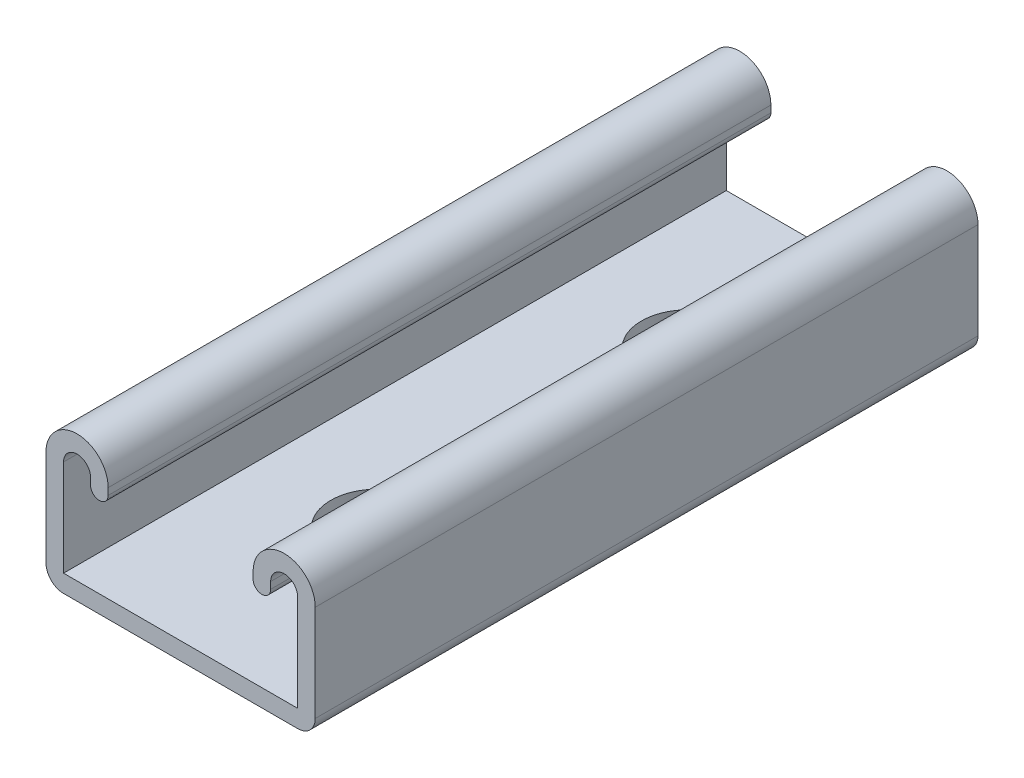
ISO-10303-21;
HEADER;
FILE_DESCRIPTION(('STEP AP214'),'2;1');
FILE_NAME('part.step','',(''),(''),'','','');
FILE_SCHEMA(('AUTOMOTIVE_DESIGN { 1 0 10303 214 1 1 1 1 }'));
ENDSEC;
DATA;
#1=APPLICATION_CONTEXT('core data for automotive mechanical design processes');
#2=APPLICATION_PROTOCOL_DEFINITION('international standard','automotive_design',2000,#1);
#3=PRODUCT_CONTEXT('',#1,'mechanical');
#4=PRODUCT('Part','Part','',(#3));
#5=PRODUCT_RELATED_PRODUCT_CATEGORY('part','',(#4));
#6=PRODUCT_DEFINITION_FORMATION('','',#4);
#7=PRODUCT_DEFINITION_CONTEXT('part definition',#1,'design');
#8=PRODUCT_DEFINITION('design','',#6,#7);
#9=PRODUCT_DEFINITION_SHAPE('','',#8);
#10=(LENGTH_UNIT() NAMED_UNIT(*) SI_UNIT(.MILLI.,.METRE.));
#11=(NAMED_UNIT(*) PLANE_ANGLE_UNIT() SI_UNIT($,.RADIAN.));
#12=(NAMED_UNIT(*) SI_UNIT($,.STERADIAN.) SOLID_ANGLE_UNIT());
#13=UNCERTAINTY_MEASURE_WITH_UNIT(LENGTH_MEASURE(1.E-05),#10,'distance_accuracy_value','');
#14=(GEOMETRIC_REPRESENTATION_CONTEXT(3) GLOBAL_UNCERTAINTY_ASSIGNED_CONTEXT((#13)) GLOBAL_UNIT_ASSIGNED_CONTEXT((#10,
#11,#12)) REPRESENTATION_CONTEXT('',''));
#15=CARTESIAN_POINT('',(0.,0.,0.));
#16=DIRECTION('',(0.,0.,1.));
#17=DIRECTION('',(1.,0.,0.));
#18=AXIS2_PLACEMENT_3D('',#15,#16,#17);
#19=CARTESIAN_POINT('',(-15.875,8.3693,101.6));
#20=DIRECTION('',(0.,0.,-1.));
#21=DIRECTION('',(-1.,0.,0.));
#22=AXIS2_PLACEMENT_3D('',#19,#20,#21);
#23=CYLINDRICAL_SURFACE('',#22,4.7625);
#24=CARTESIAN_POINT('',(-15.875,8.3693,0.));
#25=DIRECTION('',(0.,0.,1.));
#26=DIRECTION('',(-1.,0.,0.));
#27=AXIS2_PLACEMENT_3D('',#24,#25,#26);
#28=CIRCLE('',#27,4.7625);
#29=CARTESIAN_POINT('',(-11.1125,8.3693,0.));
#30=VERTEX_POINT('',#29);
#31=CARTESIAN_POINT('',(-20.6375,8.3693,0.));
#32=VERTEX_POINT('',#31);
#33=EDGE_CURVE('E189',#30,#32,#28,.T.);
#34=ORIENTED_EDGE('',*,*,#33,.T.);
#35=DIRECTION('',(0.,0.,-1.));
#36=VECTOR('',#35,1.);
#37=CARTESIAN_POINT('',(-20.6375,8.3693,101.6));
#38=LINE('',#37,#36);
#39=CARTESIAN_POINT('',(-20.6375,8.3693,101.6));
#40=VERTEX_POINT('',#39);
#41=EDGE_CURVE('E11',#40,#32,#38,.T.);
#42=ORIENTED_EDGE('',*,*,#41,.F.);
#43=CARTESIAN_POINT('',(-15.875,8.3693,101.6));
#44=DIRECTION('',(0.,0.,1.));
#45=DIRECTION('',(-1.,0.,0.));
#46=AXIS2_PLACEMENT_3D('',#43,#44,#45);
#47=CIRCLE('',#46,4.7625);
#48=CARTESIAN_POINT('',(-11.1125,8.3693,101.6));
#49=VERTEX_POINT('',#48);
#50=EDGE_CURVE('E223',#49,#40,#47,.T.);
#51=ORIENTED_EDGE('',*,*,#50,.F.);
#52=DIRECTION('',(0.,0.,-1.));
#53=VECTOR('',#52,1.);
#54=CARTESIAN_POINT('',(-11.1125,8.3693,101.6));
#55=LINE('',#54,#53);
#56=EDGE_CURVE('E185',#49,#30,#55,.T.);
#57=ORIENTED_EDGE('',*,*,#56,.T.);
#58=EDGE_LOOP('',(#34,#42,#51,#57));
#59=FACE_BOUND('',#58,.T.);
#60=ADVANCED_FACE('F32',(#59),#23,.T.);
#61=CARTESIAN_POINT('',(-20.6375,8.3693,101.6));
#62=DIRECTION('',(1.,0.,0.));
#63=DIRECTION('',(0.,1.,0.));
#64=AXIS2_PLACEMENT_3D('',#61,#62,#63);
#65=PLANE('',#64);
#66=DIRECTION('',(0.,-1.,0.));
#67=VECTOR('',#66,1.);
#68=CARTESIAN_POINT('',(-20.6375,8.3693,0.));
#69=LINE('',#68,#67);
#70=CARTESIAN_POINT('',(-20.6375,-6.4008,0.));
#71=VERTEX_POINT('',#70);
#72=EDGE_CURVE('E192',#32,#71,#69,.T.);
#73=ORIENTED_EDGE('',*,*,#72,.T.);
#74=DIRECTION('',(0.,0.,-1.));
#75=VECTOR('',#74,1.);
#76=CARTESIAN_POINT('',(-20.6375,-6.4008,101.6));
#77=LINE('',#76,#75);
#78=CARTESIAN_POINT('',(-20.6375,-6.4008,101.6));
#79=VERTEX_POINT('',#78);
#80=EDGE_CURVE('E41',#79,#71,#77,.T.);
#81=ORIENTED_EDGE('',*,*,#80,.F.);
#82=DIRECTION('',(0.,-1.,0.));
#83=VECTOR('',#82,1.);
#84=CARTESIAN_POINT('',(-20.6375,8.3693,101.6));
#85=LINE('',#84,#83);
#86=EDGE_CURVE('E122',#40,#79,#85,.T.);
#87=ORIENTED_EDGE('',*,*,#86,.F.);
#88=ORIENTED_EDGE('',*,*,#41,.T.);
#89=EDGE_LOOP('',(#73,#81,#87,#88));
#90=FACE_BOUND('',#89,.T.);
#91=ADVANCED_FACE('F332',(#90),#65,.F.);
#92=CARTESIAN_POINT('',(-17.9451,-6.4008,101.6));
#93=DIRECTION('',(0.,0.,-1.));
#94=DIRECTION('',(-1.,0.,0.));
#95=AXIS2_PLACEMENT_3D('',#92,#93,#94);
#96=CYLINDRICAL_SURFACE('',#95,2.6924);
#97=CARTESIAN_POINT('',(-17.9451,-6.4008,0.));
#98=DIRECTION('',(0.,0.,1.));
#99=DIRECTION('',(-1.,0.,0.));
#100=AXIS2_PLACEMENT_3D('',#97,#98,#99);
#101=CIRCLE('',#100,2.6924);
#102=CARTESIAN_POINT('',(-17.9451,-9.0932,0.));
#103=VERTEX_POINT('',#102);
#104=EDGE_CURVE('E194',#71,#103,#101,.T.);
#105=ORIENTED_EDGE('',*,*,#104,.T.);
#106=DIRECTION('',(0.,0.,-1.));
#107=VECTOR('',#106,1.);
#108=CARTESIAN_POINT('',(-17.9451,-9.0932,101.6));
#109=LINE('',#108,#107);
#110=CARTESIAN_POINT('',(-17.9451,-9.0932,101.6));
#111=VERTEX_POINT('',#110);
#112=EDGE_CURVE('E260',#111,#103,#109,.T.);
#113=ORIENTED_EDGE('',*,*,#112,.F.);
#114=CARTESIAN_POINT('',(-17.9451,-6.4008,101.6));
#115=DIRECTION('',(0.,0.,1.));
#116=DIRECTION('',(-1.,0.,0.));
#117=AXIS2_PLACEMENT_3D('',#114,#115,#116);
#118=CIRCLE('',#117,2.6924);
#119=EDGE_CURVE('E269',#79,#111,#118,.T.);
#120=ORIENTED_EDGE('',*,*,#119,.F.);
#121=ORIENTED_EDGE('',*,*,#80,.T.);
#122=EDGE_LOOP('',(#105,#113,#120,#121));
#123=FACE_BOUND('',#122,.T.);
#124=ADVANCED_FACE('F267',(#123),#96,.T.);
#125=CARTESIAN_POINT('',(-17.9451,-9.0932,101.6));
#126=DIRECTION('',(0.,1.,0.));
#127=DIRECTION('',(0.,0.,1.));
#128=AXIS2_PLACEMENT_3D('',#125,#126,#127);
#129=PLANE('',#128);
#130=CARTESIAN_POINT('',(0.,-9.0932,71.4375));
#131=DIRECTION('',(0.,-1.,0.));
#132=DIRECTION('',(0.,0.,-1.));
#133=AXIS2_PLACEMENT_3D('',#130,#131,#132);
#134=CIRCLE('',#133,7.14375);
#135=CARTESIAN_POINT('',(0.,-9.0932,64.29375));
#136=VERTEX_POINT('',#135);
#137=EDGE_CURVE('E451',#136,#136,#134,.T.);
#138=ORIENTED_EDGE('',*,*,#137,.F.);
#139=EDGE_LOOP('',(#138));
#140=FACE_BOUND('',#139,.T.);
#141=CARTESIAN_POINT('',(0.,-9.0932,23.8125));
#142=DIRECTION('',(0.,-1.,0.));
#143=DIRECTION('',(0.,0.,-1.));
#144=AXIS2_PLACEMENT_3D('',#141,#142,#143);
#145=CIRCLE('',#144,7.14375);
#146=CARTESIAN_POINT('',(0.,-9.0932,16.66875));
#147=VERTEX_POINT('',#146);
#148=EDGE_CURVE('E455',#147,#147,#145,.T.);
#149=ORIENTED_EDGE('',*,*,#148,.F.);
#150=EDGE_LOOP('',(#149));
#151=FACE_BOUND('',#150,.T.);
#152=DIRECTION('',(1.,0.,0.));
#153=VECTOR('',#152,1.);
#154=CARTESIAN_POINT('',(-17.9451,-9.0932,0.));
#155=LINE('',#154,#153);
#156=CARTESIAN_POINT('',(17.9451,-9.0932,0.));
#157=VERTEX_POINT('',#156);
#158=EDGE_CURVE('E196',#103,#157,#155,.T.);
#159=ORIENTED_EDGE('',*,*,#158,.T.);
#160=DIRECTION('',(0.,0.,-1.));
#161=VECTOR('',#160,1.);
#162=CARTESIAN_POINT('',(17.9451,-9.0932,101.6));
#163=LINE('',#162,#161);
#164=CARTESIAN_POINT('',(17.9451,-9.0932,101.6));
#165=VERTEX_POINT('',#164);
#166=EDGE_CURVE('E257',#165,#157,#163,.T.);
#167=ORIENTED_EDGE('',*,*,#166,.F.);
#168=DIRECTION('',(1.,0.,0.));
#169=VECTOR('',#168,1.);
#170=CARTESIAN_POINT('',(-17.9451,-9.0932,101.6));
#171=LINE('',#170,#169);
#172=EDGE_CURVE('E287',#111,#165,#171,.T.);
#173=ORIENTED_EDGE('',*,*,#172,.F.);
#174=ORIENTED_EDGE('',*,*,#112,.T.);
#175=EDGE_LOOP('',(#159,#167,#173,#174));
#176=FACE_BOUND('',#175,.T.);
#177=ADVANCED_FACE('F278',(#140,#151,#176),#129,.F.);
#178=CARTESIAN_POINT('',(17.9451,-6.4008,101.6));
#179=DIRECTION('',(0.,0.,-1.));
#180=DIRECTION('',(-1.,0.,0.));
#181=AXIS2_PLACEMENT_3D('',#178,#179,#180);
#182=CYLINDRICAL_SURFACE('',#181,2.6924);
#183=CARTESIAN_POINT('',(17.9451,-6.4008,0.));
#184=DIRECTION('',(0.,0.,1.));
#185=DIRECTION('',(1.,0.,0.));
#186=AXIS2_PLACEMENT_3D('',#183,#184,#185);
#187=CIRCLE('',#186,2.6924);
#188=CARTESIAN_POINT('',(20.6375,-6.4008,0.));
#189=VERTEX_POINT('',#188);
#190=EDGE_CURVE('E198',#157,#189,#187,.T.);
#191=ORIENTED_EDGE('',*,*,#190,.T.);
#192=DIRECTION('',(0.,0.,-1.));
#193=VECTOR('',#192,1.);
#194=CARTESIAN_POINT('',(20.6375,-6.4008,101.6));
#195=LINE('',#194,#193);
#196=CARTESIAN_POINT('',(20.6375,-6.4008,101.6));
#197=VERTEX_POINT('',#196);
#198=EDGE_CURVE('E254',#197,#189,#195,.T.);
#199=ORIENTED_EDGE('',*,*,#198,.F.);
#200=CARTESIAN_POINT('',(17.9451,-6.4008,101.6));
#201=DIRECTION('',(0.,0.,1.));
#202=DIRECTION('',(1.,0.,0.));
#203=AXIS2_PLACEMENT_3D('',#200,#201,#202);
#204=CIRCLE('',#203,2.6924);
#205=EDGE_CURVE('E284',#165,#197,#204,.T.);
#206=ORIENTED_EDGE('',*,*,#205,.F.);
#207=ORIENTED_EDGE('',*,*,#166,.T.);
#208=EDGE_LOOP('',(#191,#199,#206,#207));
#209=FACE_BOUND('',#208,.T.);
#210=ADVANCED_FACE('F282',(#209),#182,.T.);
#211=CARTESIAN_POINT('',(20.6375,-6.4008,101.6));
#212=DIRECTION('',(-1.,0.,0.));
#213=DIRECTION('',(0.,-1.,0.));
#214=AXIS2_PLACEMENT_3D('',#211,#212,#213);
#215=PLANE('',#214);
#216=DIRECTION('',(0.,1.,0.));
#217=VECTOR('',#216,1.);
#218=CARTESIAN_POINT('',(20.6375,-6.4008,0.));
#219=LINE('',#218,#217);
#220=CARTESIAN_POINT('',(20.6375,8.3693,0.));
#221=VERTEX_POINT('',#220);
#222=EDGE_CURVE('E200',#189,#221,#219,.T.);
#223=ORIENTED_EDGE('',*,*,#222,.T.);
#224=DIRECTION('',(0.,0.,-1.));
#225=VECTOR('',#224,1.);
#226=CARTESIAN_POINT('',(20.6375,8.3693,101.6));
#227=LINE('',#226,#225);
#228=CARTESIAN_POINT('',(20.6375,8.3693,101.6));
#229=VERTEX_POINT('',#228);
#230=EDGE_CURVE('E251',#229,#221,#227,.T.);
#231=ORIENTED_EDGE('',*,*,#230,.F.);
#232=DIRECTION('',(0.,1.,0.));
#233=VECTOR('',#232,1.);
#234=CARTESIAN_POINT('',(20.6375,-6.4008,101.6));
#235=LINE('',#234,#233);
#236=EDGE_CURVE('E286',#197,#229,#235,.T.);
#237=ORIENTED_EDGE('',*,*,#236,.F.);
#238=ORIENTED_EDGE('',*,*,#198,.T.);
#239=EDGE_LOOP('',(#223,#231,#237,#238));
#240=FACE_BOUND('',#239,.T.);
#241=ADVANCED_FACE('F346',(#240),#215,.F.);
#242=CARTESIAN_POINT('',(15.875,8.3693,101.6));
#243=DIRECTION('',(0.,0.,-1.));
#244=DIRECTION('',(-1.,0.,0.));
#245=AXIS2_PLACEMENT_3D('',#242,#243,#244);
#246=CYLINDRICAL_SURFACE('',#245,4.7625);
#247=CARTESIAN_POINT('',(15.875,8.3693,0.));
#248=DIRECTION('',(0.,0.,1.));
#249=DIRECTION('',(1.,0.,0.));
#250=AXIS2_PLACEMENT_3D('',#247,#248,#249);
#251=CIRCLE('',#250,4.7625);
#252=CARTESIAN_POINT('',(11.1125,8.3693,0.));
#253=VERTEX_POINT('',#252);
#254=EDGE_CURVE('E202',#221,#253,#251,.T.);
#255=ORIENTED_EDGE('',*,*,#254,.T.);
#256=DIRECTION('',(0.,0.,-1.));
#257=VECTOR('',#256,1.);
#258=CARTESIAN_POINT('',(11.1125,8.3693,101.6));
#259=LINE('',#258,#257);
#260=CARTESIAN_POINT('',(11.1125,8.3693,101.6));
#261=VERTEX_POINT('',#260);
#262=EDGE_CURVE('E248',#261,#253,#259,.T.);
#263=ORIENTED_EDGE('',*,*,#262,.F.);
#264=CARTESIAN_POINT('',(15.875,8.3693,101.6));
#265=DIRECTION('',(0.,0.,1.));
#266=DIRECTION('',(1.,0.,0.));
#267=AXIS2_PLACEMENT_3D('',#264,#265,#266);
#268=CIRCLE('',#267,4.7625);
#269=EDGE_CURVE('E289',#229,#261,#268,.T.);
#270=ORIENTED_EDGE('',*,*,#269,.F.);
#271=ORIENTED_EDGE('',*,*,#230,.T.);
#272=EDGE_LOOP('',(#255,#263,#270,#271));
#273=FACE_BOUND('',#272,.T.);
#274=ADVANCED_FACE('F349',(#273),#246,.T.);
#275=CARTESIAN_POINT('',(11.1125,8.3693,101.6));
#276=DIRECTION('',(1.,0.,0.));
#277=DIRECTION('',(0.,0.,-1.));
#278=AXIS2_PLACEMENT_3D('',#275,#276,#277);
#279=PLANE('',#278);
#280=DIRECTION('',(0.,-1.,0.));
#281=VECTOR('',#280,1.);
#282=CARTESIAN_POINT('',(11.1125,8.3693,0.));
#283=LINE('',#282,#281);
#284=CARTESIAN_POINT('',(11.1125,7.33425,0.));
#285=VERTEX_POINT('',#284);
#286=EDGE_CURVE('E204',#253,#285,#283,.T.);
#287=ORIENTED_EDGE('',*,*,#286,.T.);
#288=DIRECTION('',(0.,0.,-1.));
#289=VECTOR('',#288,1.);
#290=CARTESIAN_POINT('',(11.1125,7.33425,101.6));
#291=LINE('',#290,#289);
#292=CARTESIAN_POINT('',(11.1125,7.33425,101.6));
#293=VERTEX_POINT('',#292);
#294=EDGE_CURVE('E245',#293,#285,#291,.T.);
#295=ORIENTED_EDGE('',*,*,#294,.F.);
#296=DIRECTION('',(0.,-1.,0.));
#297=VECTOR('',#296,1.);
#298=CARTESIAN_POINT('',(11.1125,8.3693,101.6));
#299=LINE('',#298,#297);
#300=EDGE_CURVE('E295',#261,#293,#299,.T.);
#301=ORIENTED_EDGE('',*,*,#300,.F.);
#302=ORIENTED_EDGE('',*,*,#262,.T.);
#303=EDGE_LOOP('',(#287,#295,#301,#302));
#304=FACE_BOUND('',#303,.T.);
#305=ADVANCED_FACE('F353',(#304),#279,.F.);
#306=CARTESIAN_POINT('',(12.4587,7.33425,101.6));
#307=DIRECTION('',(0.,0.,-1.));
#308=DIRECTION('',(-1.,0.,0.));
#309=AXIS2_PLACEMENT_3D('',#306,#307,#308);
#310=CYLINDRICAL_SURFACE('',#309,1.3462);
#311=CARTESIAN_POINT('',(12.4587,7.33425,0.));
#312=DIRECTION('',(0.,0.,1.));
#313=DIRECTION('',(1.,0.,0.));
#314=AXIS2_PLACEMENT_3D('',#311,#312,#313);
#315=CIRCLE('',#314,1.3462);
#316=CARTESIAN_POINT('',(13.8049,7.33425,0.));
#317=VERTEX_POINT('',#316);
#318=EDGE_CURVE('E206',#285,#317,#315,.T.);
#319=ORIENTED_EDGE('',*,*,#318,.T.);
#320=DIRECTION('',(0.,0.,-1.));
#321=VECTOR('',#320,1.);
#322=CARTESIAN_POINT('',(13.8049,7.33425,101.6));
#323=LINE('',#322,#321);
#324=CARTESIAN_POINT('',(13.8049,7.33425,101.6));
#325=VERTEX_POINT('',#324);
#326=EDGE_CURVE('E242',#325,#317,#323,.T.);
#327=ORIENTED_EDGE('',*,*,#326,.F.);
#328=CARTESIAN_POINT('',(12.4587,7.33425,101.6));
#329=DIRECTION('',(0.,0.,1.));
#330=DIRECTION('',(1.,0.,0.));
#331=AXIS2_PLACEMENT_3D('',#328,#329,#330);
#332=CIRCLE('',#331,1.3462);
#333=EDGE_CURVE('E297',#293,#325,#332,.T.);
#334=ORIENTED_EDGE('',*,*,#333,.F.);
#335=ORIENTED_EDGE('',*,*,#294,.T.);
#336=EDGE_LOOP('',(#319,#327,#334,#335));
#337=FACE_BOUND('',#336,.T.);
#338=ADVANCED_FACE('F357',(#337),#310,.T.);
#339=CARTESIAN_POINT('',(13.8049,8.3693,101.6));
#340=DIRECTION('',(-1.,0.,0.));
#341=DIRECTION('',(0.,0.,1.));
#342=AXIS2_PLACEMENT_3D('',#339,#340,#341);
#343=PLANE('',#342);
#344=DIRECTION('',(0.,1.,0.));
#345=VECTOR('',#344,1.);
#346=CARTESIAN_POINT('',(13.8049,8.3693,0.));
#347=LINE('',#346,#345);
#348=CARTESIAN_POINT('',(13.8049,8.3693,0.));
#349=VERTEX_POINT('',#348);
#350=EDGE_CURVE('E208',#317,#349,#347,.T.);
#351=ORIENTED_EDGE('',*,*,#350,.T.);
#352=DIRECTION('',(0.,0.,-1.));
#353=VECTOR('',#352,1.);
#354=CARTESIAN_POINT('',(13.8049,8.3693,101.6));
#355=LINE('',#354,#353);
#356=CARTESIAN_POINT('',(13.8049,8.3693,101.6));
#357=VERTEX_POINT('',#356);
#358=EDGE_CURVE('E239',#357,#349,#355,.T.);
#359=ORIENTED_EDGE('',*,*,#358,.F.);
#360=DIRECTION('',(0.,1.,0.));
#361=VECTOR('',#360,1.);
#362=CARTESIAN_POINT('',(13.8049,8.3693,101.6));
#363=LINE('',#362,#361);
#364=EDGE_CURVE('E299',#325,#357,#363,.T.);
#365=ORIENTED_EDGE('',*,*,#364,.F.);
#366=ORIENTED_EDGE('',*,*,#326,.T.);
#367=EDGE_LOOP('',(#351,#359,#365,#366));
#368=FACE_BOUND('',#367,.T.);
#369=ADVANCED_FACE('F361',(#368),#343,.F.);
#370=CARTESIAN_POINT('',(15.875,8.3693,101.6));
#371=DIRECTION('',(0.,0.,-1.));
#372=DIRECTION('',(-1.,0.,0.));
#373=AXIS2_PLACEMENT_3D('',#370,#371,#372);
#374=CYLINDRICAL_SURFACE('',#373,2.0701);
#375=CARTESIAN_POINT('',(15.875,8.3693,0.));
#376=DIRECTION('',(0.,0.,-1.));
#377=DIRECTION('',(1.,0.,0.));
#378=AXIS2_PLACEMENT_3D('',#375,#376,#377);
#379=CIRCLE('',#378,2.0701);
#380=CARTESIAN_POINT('',(17.9451,8.3693,0.));
#381=VERTEX_POINT('',#380);
#382=EDGE_CURVE('E210',#349,#381,#379,.T.);
#383=ORIENTED_EDGE('',*,*,#382,.T.);
#384=DIRECTION('',(0.,0.,-1.));
#385=VECTOR('',#384,1.);
#386=CARTESIAN_POINT('',(17.9451,8.3693,101.6));
#387=LINE('',#386,#385);
#388=CARTESIAN_POINT('',(17.9451,8.3693,101.6));
#389=VERTEX_POINT('',#388);
#390=EDGE_CURVE('E236',#389,#381,#387,.T.);
#391=ORIENTED_EDGE('',*,*,#390,.F.);
#392=CARTESIAN_POINT('',(15.875,8.3693,101.6));
#393=DIRECTION('',(0.,0.,-1.));
#394=DIRECTION('',(1.,0.,0.));
#395=AXIS2_PLACEMENT_3D('',#392,#393,#394);
#396=CIRCLE('',#395,2.0701);
#397=EDGE_CURVE('E301',#357,#389,#396,.T.);
#398=ORIENTED_EDGE('',*,*,#397,.F.);
#399=ORIENTED_EDGE('',*,*,#358,.T.);
#400=EDGE_LOOP('',(#383,#391,#398,#399));
#401=FACE_BOUND('',#400,.T.);
#402=ADVANCED_FACE('F365',(#401),#374,.F.);
#403=CARTESIAN_POINT('',(17.9451,-6.4008,101.6));
#404=DIRECTION('',(1.,0.,0.));
#405=DIRECTION('',(0.,1.,0.));
#406=AXIS2_PLACEMENT_3D('',#403,#404,#405);
#407=PLANE('',#406);
#408=DIRECTION('',(0.,-1.,0.));
#409=VECTOR('',#408,1.);
#410=CARTESIAN_POINT('',(17.9451,-6.4008,0.));
#411=LINE('',#410,#409);
#412=CARTESIAN_POINT('',(17.9451,-6.4008,0.));
#413=VERTEX_POINT('',#412);
#414=EDGE_CURVE('E212',#381,#413,#411,.T.);
#415=ORIENTED_EDGE('',*,*,#414,.T.);
#416=DIRECTION('',(0.,0.,-1.));
#417=VECTOR('',#416,1.);
#418=CARTESIAN_POINT('',(17.9451,-6.4008,101.6));
#419=LINE('',#418,#417);
#420=CARTESIAN_POINT('',(17.9451,-6.4008,101.6));
#421=VERTEX_POINT('',#420);
#422=EDGE_CURVE('E233',#421,#413,#419,.T.);
#423=ORIENTED_EDGE('',*,*,#422,.F.);
#424=DIRECTION('',(0.,-1.,0.));
#425=VECTOR('',#424,1.);
#426=CARTESIAN_POINT('',(17.9451,-6.4008,101.6));
#427=LINE('',#426,#425);
#428=EDGE_CURVE('E303',#389,#421,#427,.T.);
#429=ORIENTED_EDGE('',*,*,#428,.F.);
#430=ORIENTED_EDGE('',*,*,#390,.T.);
#431=EDGE_LOOP('',(#415,#423,#429,#430));
#432=FACE_BOUND('',#431,.T.);
#433=ADVANCED_FACE('F369',(#432),#407,.F.);
#434=CARTESIAN_POINT('',(-17.9451,-6.4008,101.6));
#435=DIRECTION('',(0.,-1.,0.));
#436=DIRECTION('',(0.,0.,-1.));
#437=AXIS2_PLACEMENT_3D('',#434,#435,#436);
#438=PLANE('',#437);
#439=CARTESIAN_POINT('',(0.,-6.4008,71.4375));
#440=DIRECTION('',(0.,-1.,0.));
#441=DIRECTION('',(0.,0.,-1.));
#442=AXIS2_PLACEMENT_3D('',#439,#440,#441);
#443=CIRCLE('',#442,7.14375);
#444=CARTESIAN_POINT('',(0.,-6.4008,64.29375));
#445=VERTEX_POINT('',#444);
#446=EDGE_CURVE('E454',#445,#445,#443,.T.);
#447=ORIENTED_EDGE('',*,*,#446,.T.);
#448=EDGE_LOOP('',(#447));
#449=FACE_BOUND('',#448,.T.);
#450=CARTESIAN_POINT('',(0.,-6.4008,23.8125));
#451=DIRECTION('',(0.,-1.,0.));
#452=DIRECTION('',(0.,0.,-1.));
#453=AXIS2_PLACEMENT_3D('',#450,#451,#452);
#454=CIRCLE('',#453,7.14375);
#455=CARTESIAN_POINT('',(0.,-6.4008,16.66875));
#456=VERTEX_POINT('',#455);
#457=EDGE_CURVE('E35',#456,#456,#454,.T.);
#458=ORIENTED_EDGE('',*,*,#457,.T.);
#459=EDGE_LOOP('',(#458));
#460=FACE_BOUND('',#459,.T.);
#461=DIRECTION('',(-1.,0.,0.));
#462=VECTOR('',#461,1.);
#463=CARTESIAN_POINT('',(-17.9451,-6.4008,0.));
#464=LINE('',#463,#462);
#465=CARTESIAN_POINT('',(-17.9451,-6.4008,0.));
#466=VERTEX_POINT('',#465);
#467=EDGE_CURVE('E214',#413,#466,#464,.T.);
#468=ORIENTED_EDGE('',*,*,#467,.T.);
#469=DIRECTION('',(0.,0.,-1.));
#470=VECTOR('',#469,1.);
#471=CARTESIAN_POINT('',(-17.9451,-6.4008,101.6));
#472=LINE('',#471,#470);
#473=CARTESIAN_POINT('',(-17.9451,-6.4008,101.6));
#474=VERTEX_POINT('',#473);
#475=EDGE_CURVE('E230',#474,#466,#472,.T.);
#476=ORIENTED_EDGE('',*,*,#475,.F.);
#477=DIRECTION('',(-1.,0.,0.));
#478=VECTOR('',#477,1.);
#479=CARTESIAN_POINT('',(-17.9451,-6.4008,101.6));
#480=LINE('',#479,#478);
#481=EDGE_CURVE('E305',#421,#474,#480,.T.);
#482=ORIENTED_EDGE('',*,*,#481,.F.);
#483=ORIENTED_EDGE('',*,*,#422,.T.);
#484=EDGE_LOOP('',(#468,#476,#482,#483));
#485=FACE_BOUND('',#484,.T.);
#486=ADVANCED_FACE('F373',(#449,#460,#485),#438,.F.);
#487=CARTESIAN_POINT('',(-17.9451,8.3693,101.6));
#488=DIRECTION('',(-1.,0.,0.));
#489=DIRECTION('',(0.,-1.,0.));
#490=AXIS2_PLACEMENT_3D('',#487,#488,#489);
#491=PLANE('',#490);
#492=DIRECTION('',(0.,1.,0.));
#493=VECTOR('',#492,1.);
#494=CARTESIAN_POINT('',(-17.9451,8.3693,0.));
#495=LINE('',#494,#493);
#496=CARTESIAN_POINT('',(-17.9451,8.3693,0.));
#497=VERTEX_POINT('',#496);
#498=EDGE_CURVE('E216',#466,#497,#495,.T.);
#499=ORIENTED_EDGE('',*,*,#498,.T.);
#500=DIRECTION('',(0.,0.,-1.));
#501=VECTOR('',#500,1.);
#502=CARTESIAN_POINT('',(-17.9451,8.3693,101.6));
#503=LINE('',#502,#501);
#504=CARTESIAN_POINT('',(-17.9451,8.3693,101.6));
#505=VERTEX_POINT('',#504);
#506=EDGE_CURVE('E227',#505,#497,#503,.T.);
#507=ORIENTED_EDGE('',*,*,#506,.F.);
#508=DIRECTION('',(0.,1.,0.));
#509=VECTOR('',#508,1.);
#510=CARTESIAN_POINT('',(-17.9451,8.3693,101.6));
#511=LINE('',#510,#509);
#512=EDGE_CURVE('E307',#474,#505,#511,.T.);
#513=ORIENTED_EDGE('',*,*,#512,.F.);
#514=ORIENTED_EDGE('',*,*,#475,.T.);
#515=EDGE_LOOP('',(#499,#507,#513,#514));
#516=FACE_BOUND('',#515,.T.);
#517=ADVANCED_FACE('F313',(#516),#491,.F.);
#518=CARTESIAN_POINT('',(-15.875,8.3693,101.6));
#519=DIRECTION('',(0.,0.,-1.));
#520=DIRECTION('',(-1.,0.,0.));
#521=AXIS2_PLACEMENT_3D('',#518,#519,#520);
#522=CYLINDRICAL_SURFACE('',#521,2.0701);
#523=CARTESIAN_POINT('',(-15.875,8.3693,0.));
#524=DIRECTION('',(0.,0.,-1.));
#525=DIRECTION('',(-1.,0.,0.));
#526=AXIS2_PLACEMENT_3D('',#523,#524,#525);
#527=CIRCLE('',#526,2.0701);
#528=CARTESIAN_POINT('',(-13.8049,8.3693,0.));
#529=VERTEX_POINT('',#528);
#530=EDGE_CURVE('E218',#497,#529,#527,.T.);
#531=ORIENTED_EDGE('',*,*,#530,.T.);
#532=DIRECTION('',(0.,0.,-1.));
#533=VECTOR('',#532,1.);
#534=CARTESIAN_POINT('',(-13.8049,8.3693,101.6));
#535=LINE('',#534,#533);
#536=CARTESIAN_POINT('',(-13.8049,8.3693,101.6));
#537=VERTEX_POINT('',#536);
#538=EDGE_CURVE('E180',#537,#529,#535,.T.);
#539=ORIENTED_EDGE('',*,*,#538,.F.);
#540=CARTESIAN_POINT('',(-15.875,8.3693,101.6));
#541=DIRECTION('',(0.,0.,-1.));
#542=DIRECTION('',(-1.,0.,0.));
#543=AXIS2_PLACEMENT_3D('',#540,#541,#542);
#544=CIRCLE('',#543,2.0701);
#545=EDGE_CURVE('E171',#505,#537,#544,.T.);
#546=ORIENTED_EDGE('',*,*,#545,.F.);
#547=ORIENTED_EDGE('',*,*,#506,.T.);
#548=EDGE_LOOP('',(#531,#539,#546,#547));
#549=FACE_BOUND('',#548,.T.);
#550=ADVANCED_FACE('F317',(#549),#522,.F.);
#551=CARTESIAN_POINT('',(-13.8049,8.3693,101.6));
#552=DIRECTION('',(1.,0.,0.));
#553=DIRECTION('',(0.,1.,0.));
#554=AXIS2_PLACEMENT_3D('',#551,#552,#553);
#555=PLANE('',#554);
#556=DIRECTION('',(0.,-1.,0.));
#557=VECTOR('',#556,1.);
#558=CARTESIAN_POINT('',(-13.8049,8.3693,0.));
#559=LINE('',#558,#557);
#560=CARTESIAN_POINT('',(-13.8049,7.33425,0.));
#561=VERTEX_POINT('',#560);
#562=EDGE_CURVE('E179',#529,#561,#559,.T.);
#563=ORIENTED_EDGE('',*,*,#562,.T.);
#564=DIRECTION('',(0.,0.,-1.));
#565=VECTOR('',#564,1.);
#566=CARTESIAN_POINT('',(-13.8049,7.33425,101.6));
#567=LINE('',#566,#565);
#568=CARTESIAN_POINT('',(-13.8049,7.33425,101.6));
#569=VERTEX_POINT('',#568);
#570=EDGE_CURVE('E176',#569,#561,#567,.T.);
#571=ORIENTED_EDGE('',*,*,#570,.F.);
#572=DIRECTION('',(0.,-1.,0.));
#573=VECTOR('',#572,1.);
#574=CARTESIAN_POINT('',(-13.8049,8.3693,101.6));
#575=LINE('',#574,#573);
#576=EDGE_CURVE('E165',#537,#569,#575,.T.);
#577=ORIENTED_EDGE('',*,*,#576,.F.);
#578=ORIENTED_EDGE('',*,*,#538,.T.);
#579=EDGE_LOOP('',(#563,#571,#577,#578));
#580=FACE_BOUND('',#579,.T.);
#581=ADVANCED_FACE('F177',(#580),#555,.F.);
#582=CARTESIAN_POINT('',(-12.4587,7.33425,101.6));
#583=DIRECTION('',(0.,0.,-1.));
#584=DIRECTION('',(-1.,0.,0.));
#585=AXIS2_PLACEMENT_3D('',#582,#583,#584);
#586=CYLINDRICAL_SURFACE('',#585,1.3462);
#587=CARTESIAN_POINT('',(-12.4587,7.33425,0.));
#588=DIRECTION('',(0.,0.,1.));
#589=DIRECTION('',(-1.,0.,0.));
#590=AXIS2_PLACEMENT_3D('',#587,#588,#589);
#591=CIRCLE('',#590,1.3462);
#592=CARTESIAN_POINT('',(-11.1125,7.33425,0.));
#593=VERTEX_POINT('',#592);
#594=EDGE_CURVE('E108',#561,#593,#591,.T.);
#595=ORIENTED_EDGE('',*,*,#594,.T.);
#596=DIRECTION('',(0.,0.,-1.));
#597=VECTOR('',#596,1.);
#598=CARTESIAN_POINT('',(-11.1125,7.33425,101.6));
#599=LINE('',#598,#597);
#600=CARTESIAN_POINT('',(-11.1125,7.33425,101.6));
#601=VERTEX_POINT('',#600);
#602=EDGE_CURVE('E181',#601,#593,#599,.T.);
#603=ORIENTED_EDGE('',*,*,#602,.F.);
#604=CARTESIAN_POINT('',(-12.4587,7.33425,101.6));
#605=DIRECTION('',(0.,0.,1.));
#606=DIRECTION('',(-1.,0.,0.));
#607=AXIS2_PLACEMENT_3D('',#604,#605,#606);
#608=CIRCLE('',#607,1.3462);
#609=EDGE_CURVE('E169',#569,#601,#608,.T.);
#610=ORIENTED_EDGE('',*,*,#609,.F.);
#611=ORIENTED_EDGE('',*,*,#570,.T.);
#612=EDGE_LOOP('',(#595,#603,#610,#611));
#613=FACE_BOUND('',#612,.T.);
#614=ADVANCED_FACE('F183',(#613),#586,.T.);
#615=CARTESIAN_POINT('',(-11.1125,8.3693,101.6));
#616=DIRECTION('',(-1.,0.,0.));
#617=DIRECTION('',(0.,0.,1.));
#618=AXIS2_PLACEMENT_3D('',#615,#616,#617);
#619=PLANE('',#618);
#620=DIRECTION('',(0.,1.,0.));
#621=VECTOR('',#620,1.);
#622=CARTESIAN_POINT('',(-11.1125,8.3693,0.));
#623=LINE('',#622,#621);
#624=EDGE_CURVE('E114',#593,#30,#623,.T.);
#625=ORIENTED_EDGE('',*,*,#624,.T.);
#626=ORIENTED_EDGE('',*,*,#56,.F.);
#627=DIRECTION('',(0.,1.,0.));
#628=VECTOR('',#627,1.);
#629=CARTESIAN_POINT('',(-11.1125,8.3693,101.6));
#630=LINE('',#629,#628);
#631=EDGE_CURVE('E49',#601,#49,#630,.T.);
#632=ORIENTED_EDGE('',*,*,#631,.F.);
#633=ORIENTED_EDGE('',*,*,#602,.T.);
#634=EDGE_LOOP('',(#625,#626,#632,#633));
#635=FACE_BOUND('',#634,.T.);
#636=ADVANCED_FACE('F321',(#635),#619,.F.);
#637=CARTESIAN_POINT('',(-15.875,8.3693,101.6));
#638=DIRECTION('',(0.,0.,-1.));
#639=DIRECTION('',(-1.,0.,0.));
#640=AXIS2_PLACEMENT_3D('',#637,#638,#639);
#641=PLANE('',#640);
#642=ORIENTED_EDGE('',*,*,#50,.T.);
#643=ORIENTED_EDGE('',*,*,#86,.T.);
#644=ORIENTED_EDGE('',*,*,#119,.T.);
#645=ORIENTED_EDGE('',*,*,#172,.T.);
#646=ORIENTED_EDGE('',*,*,#205,.T.);
#647=ORIENTED_EDGE('',*,*,#236,.T.);
#648=ORIENTED_EDGE('',*,*,#269,.T.);
#649=ORIENTED_EDGE('',*,*,#300,.T.);
#650=ORIENTED_EDGE('',*,*,#333,.T.);
#651=ORIENTED_EDGE('',*,*,#364,.T.);
#652=ORIENTED_EDGE('',*,*,#397,.T.);
#653=ORIENTED_EDGE('',*,*,#428,.T.);
#654=ORIENTED_EDGE('',*,*,#481,.T.);
#655=ORIENTED_EDGE('',*,*,#512,.T.);
#656=ORIENTED_EDGE('',*,*,#545,.T.);
#657=ORIENTED_EDGE('',*,*,#576,.T.);
#658=ORIENTED_EDGE('',*,*,#609,.T.);
#659=ORIENTED_EDGE('',*,*,#631,.T.);
#660=EDGE_LOOP('',(#642,#643,#644,#645,#646,#647,#648,#649,#650,#651,#652,#653,#654,#655,#656,
#657,#658,#659));
#661=FACE_BOUND('',#660,.T.);
#662=ADVANCED_FACE('F167',(#661),#641,.F.);
#663=CARTESIAN_POINT('',(-15.875,8.3693,0.));
#664=DIRECTION('',(0.,0.,-1.));
#665=DIRECTION('',(-1.,0.,0.));
#666=AXIS2_PLACEMENT_3D('',#663,#664,#665);
#667=PLANE('',#666);
#668=ORIENTED_EDGE('',*,*,#33,.F.);
#669=ORIENTED_EDGE('',*,*,#624,.F.);
#670=ORIENTED_EDGE('',*,*,#594,.F.);
#671=ORIENTED_EDGE('',*,*,#562,.F.);
#672=ORIENTED_EDGE('',*,*,#530,.F.);
#673=ORIENTED_EDGE('',*,*,#498,.F.);
#674=ORIENTED_EDGE('',*,*,#467,.F.);
#675=ORIENTED_EDGE('',*,*,#414,.F.);
#676=ORIENTED_EDGE('',*,*,#382,.F.);
#677=ORIENTED_EDGE('',*,*,#350,.F.);
#678=ORIENTED_EDGE('',*,*,#318,.F.);
#679=ORIENTED_EDGE('',*,*,#286,.F.);
#680=ORIENTED_EDGE('',*,*,#254,.F.);
#681=ORIENTED_EDGE('',*,*,#222,.F.);
#682=ORIENTED_EDGE('',*,*,#190,.F.);
#683=ORIENTED_EDGE('',*,*,#158,.F.);
#684=ORIENTED_EDGE('',*,*,#104,.F.);
#685=ORIENTED_EDGE('',*,*,#72,.F.);
#686=EDGE_LOOP('',(#668,#669,#670,#671,#672,#673,#674,#675,#676,#677,#678,#679,#680,#681,#682,
#683,#684,#685));
#687=FACE_BOUND('',#686,.T.);
#688=ADVANCED_FACE('F273',(#687),#667,.T.);
#689=CARTESIAN_POINT('',(0.,13.1318,23.8125));
#690=DIRECTION('',(0.,-1.,0.));
#691=DIRECTION('',(0.,0.,-1.));
#692=AXIS2_PLACEMENT_3D('',#689,#690,#691);
#693=CYLINDRICAL_SURFACE('',#692,7.14375);
#694=ORIENTED_EDGE('',*,*,#148,.T.);
#695=EDGE_LOOP('',(#694));
#696=FACE_BOUND('',#695,.T.);
#697=ORIENTED_EDGE('',*,*,#457,.F.);
#698=EDGE_LOOP('',(#697));
#699=FACE_BOUND('',#698,.T.);
#700=ADVANCED_FACE('F410',(#696,#699),#693,.F.);
#701=CARTESIAN_POINT('',(0.,13.1318,71.4375));
#702=DIRECTION('',(0.,-1.,0.));
#703=DIRECTION('',(0.,0.,-1.));
#704=AXIS2_PLACEMENT_3D('',#701,#702,#703);
#705=CYLINDRICAL_SURFACE('',#704,7.14375);
#706=ORIENTED_EDGE('',*,*,#137,.T.);
#707=EDGE_LOOP('',(#706));
#708=FACE_BOUND('',#707,.T.);
#709=ORIENTED_EDGE('',*,*,#446,.F.);
#710=EDGE_LOOP('',(#709));
#711=FACE_BOUND('',#710,.T.);
#712=ADVANCED_FACE('F418',(#708,#711),#705,.F.);
#713=CLOSED_SHELL('',(#60,#91,#124,#177,#210,#241,#274,#305,#338,#369,#402,#433,#486,#517,#550,
#581,#614,#636,#662,#688,#700,#712));
#714=MANIFOLD_SOLID_BREP('B2',#713);
#715=ADVANCED_BREP_SHAPE_REPRESENTATION('',(#18,#714),#14);
#716=SHAPE_DEFINITION_REPRESENTATION(#9,#715);
ENDSEC;
END-ISO-10303-21;
